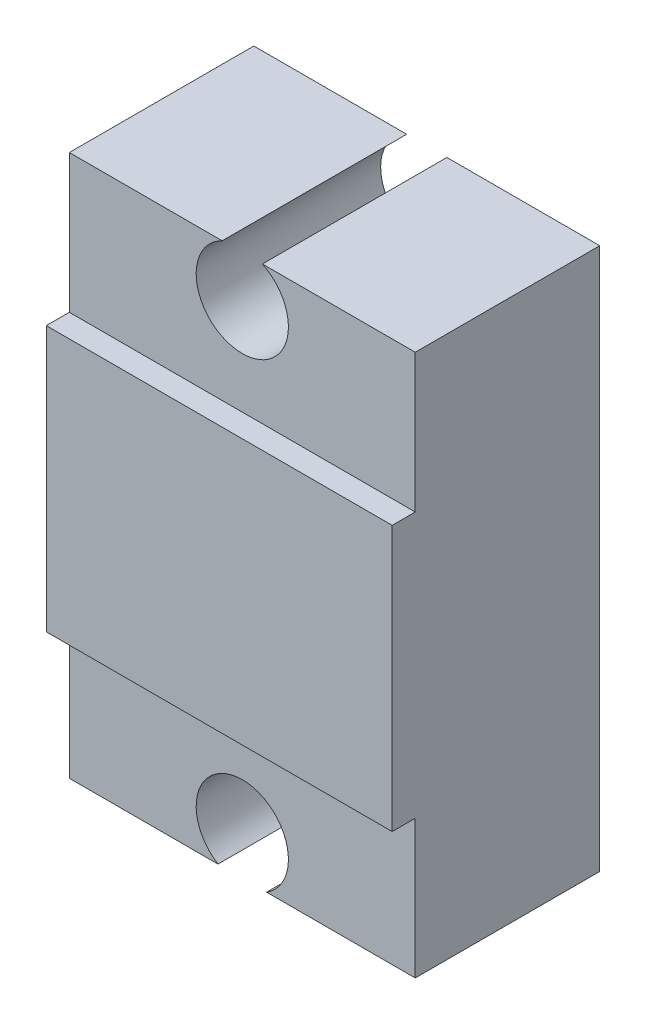
ISO-10303-21;
HEADER;
FILE_DESCRIPTION(('STEP AP214'),'2;1');
FILE_NAME('part.step','',(''),(''),'','','');
FILE_SCHEMA(('AUTOMOTIVE_DESIGN { 1 0 10303 214 1 1 1 1 }'));
ENDSEC;
DATA;
#1=APPLICATION_CONTEXT('core data for automotive mechanical design processes');
#2=APPLICATION_PROTOCOL_DEFINITION('international standard','automotive_design',2000,#1);
#3=PRODUCT_CONTEXT('',#1,'mechanical');
#4=PRODUCT('Part','Part','',(#3));
#5=PRODUCT_RELATED_PRODUCT_CATEGORY('part','',(#4));
#6=PRODUCT_DEFINITION_FORMATION('','',#4);
#7=PRODUCT_DEFINITION_CONTEXT('part definition',#1,'design');
#8=PRODUCT_DEFINITION('design','',#6,#7);
#9=PRODUCT_DEFINITION_SHAPE('','',#8);
#10=(LENGTH_UNIT() NAMED_UNIT(*) SI_UNIT(.MILLI.,.METRE.));
#11=(NAMED_UNIT(*) PLANE_ANGLE_UNIT() SI_UNIT($,.RADIAN.));
#12=(NAMED_UNIT(*) SI_UNIT($,.STERADIAN.) SOLID_ANGLE_UNIT());
#13=UNCERTAINTY_MEASURE_WITH_UNIT(LENGTH_MEASURE(1.E-05),#10,'distance_accuracy_value','');
#14=(GEOMETRIC_REPRESENTATION_CONTEXT(3) GLOBAL_UNCERTAINTY_ASSIGNED_CONTEXT((#13)) GLOBAL_UNIT_ASSIGNED_CONTEXT((#10,
#11,#12)) REPRESENTATION_CONTEXT('',''));
#15=CARTESIAN_POINT('',(0.,0.,0.));
#16=DIRECTION('',(0.,0.,1.));
#17=DIRECTION('',(1.,0.,0.));
#18=AXIS2_PLACEMENT_3D('',#15,#16,#17);
#19=CARTESIAN_POINT('',(-7.86190476190475,-19.828630952381,11.43));
#20=DIRECTION('',(0.,1.,0.));
#21=DIRECTION('',(0.,0.,1.));
#22=AXIS2_PLACEMENT_3D('',#19,#20,#21);
#23=PLANE('',#22);
#24=DIRECTION('',(0.,0.,1.));
#25=VECTOR('',#24,1.);
#26=CARTESIAN_POINT('',(0.32506721148295,-19.828630952381,0.));
#27=LINE('',#26,#25);
#28=CARTESIAN_POINT('',(0.32506721148295,-19.828630952381,0.));
#29=VERTEX_POINT('',#28);
#30=CARTESIAN_POINT('',(0.32506721148295,-19.828630952381,10.16));
#31=VERTEX_POINT('',#30);
#32=EDGE_CURVE('E186',#29,#31,#27,.T.);
#33=ORIENTED_EDGE('',*,*,#32,.T.);
#34=DIRECTION('',(1.,0.,0.));
#35=VECTOR('',#34,1.);
#36=CARTESIAN_POINT('',(-7.86190476190475,-19.828630952381,10.16));
#37=LINE('',#36,#35);
#38=CARTESIAN_POINT('',(-7.86190476190475,-19.828630952381,10.16));
#39=VERTEX_POINT('',#38);
#40=EDGE_CURVE('E55',#39,#31,#37,.T.);
#41=ORIENTED_EDGE('',*,*,#40,.F.);
#42=DIRECTION('',(0.,0.,-1.));
#43=VECTOR('',#42,1.);
#44=CARTESIAN_POINT('',(-7.86190476190475,-19.828630952381,11.43));
#45=LINE('',#44,#43);
#46=CARTESIAN_POINT('',(-7.86190476190475,-19.828630952381,0.));
#47=VERTEX_POINT('',#46);
#48=EDGE_CURVE('E230',#39,#47,#45,.T.);
#49=ORIENTED_EDGE('',*,*,#48,.T.);
#50=DIRECTION('',(1.,0.,0.));
#51=VECTOR('',#50,1.);
#52=CARTESIAN_POINT('',(-7.86190476190475,-19.828630952381,0.));
#53=LINE('',#52,#51);
#54=EDGE_CURVE('E210',#47,#29,#53,.T.);
#55=ORIENTED_EDGE('',*,*,#54,.T.);
#56=EDGE_LOOP('',(#33,#41,#49,#55));
#57=FACE_BOUND('',#56,.T.);
#58=ADVANCED_FACE('F39',(#57),#23,.F.);
#59=CARTESIAN_POINT('',(-7.86190476190475,10.016369047619,11.43));
#60=DIRECTION('',(0.,-1.,0.));
#61=DIRECTION('',(0.,0.,-1.));
#62=AXIS2_PLACEMENT_3D('',#59,#60,#61);
#63=PLANE('',#62);
#64=DIRECTION('',(0.,0.,1.));
#65=VECTOR('',#64,1.);
#66=CARTESIAN_POINT('',(2.77025556975458,10.016369047619,0.));
#67=LINE('',#66,#65);
#68=CARTESIAN_POINT('',(2.77025556975458,10.016369047619,0.));
#69=VERTEX_POINT('',#68);
#70=CARTESIAN_POINT('',(2.77025556975458,10.016369047619,10.16));
#71=VERTEX_POINT('',#70);
#72=EDGE_CURVE('E193',#69,#71,#67,.T.);
#73=ORIENTED_EDGE('',*,*,#72,.T.);
#74=DIRECTION('',(-1.,0.,0.));
#75=VECTOR('',#74,1.);
#76=CARTESIAN_POINT('',(-7.86190476190475,10.016369047619,10.16));
#77=LINE('',#76,#75);
#78=CARTESIAN_POINT('',(11.1880952380953,10.016369047619,10.16));
#79=VERTEX_POINT('',#78);
#80=EDGE_CURVE('E62',#79,#71,#77,.T.);
#81=ORIENTED_EDGE('',*,*,#80,.F.);
#82=DIRECTION('',(0.,0.,-1.));
#83=VECTOR('',#82,1.);
#84=CARTESIAN_POINT('',(11.1880952380952,10.016369047619,11.43));
#85=LINE('',#84,#83);
#86=CARTESIAN_POINT('',(11.1880952380952,10.016369047619,0.));
#87=VERTEX_POINT('',#86);
#88=EDGE_CURVE('E224',#79,#87,#85,.T.);
#89=ORIENTED_EDGE('',*,*,#88,.T.);
#90=DIRECTION('',(-1.,0.,0.));
#91=VECTOR('',#90,1.);
#92=CARTESIAN_POINT('',(-7.86190476190475,10.016369047619,0.));
#93=LINE('',#92,#91);
#94=EDGE_CURVE('E201',#87,#69,#93,.T.);
#95=ORIENTED_EDGE('',*,*,#94,.T.);
#96=EDGE_LOOP('',(#73,#81,#89,#95));
#97=FACE_BOUND('',#96,.T.);
#98=ADVANCED_FACE('F246',(#97),#63,.F.);
#99=CARTESIAN_POINT('',(-7.86190476190475,10.016369047619,11.43));
#100=DIRECTION('',(1.,0.,0.));
#101=DIRECTION('',(0.,1.,0.));
#102=AXIS2_PLACEMENT_3D('',#99,#100,#101);
#103=PLANE('',#102);
#104=DIRECTION('',(0.,-1.,0.));
#105=VECTOR('',#104,1.);
#106=CARTESIAN_POINT('',(-7.86190476190475,10.016369047619,11.43));
#107=LINE('',#106,#105);
#108=CARTESIAN_POINT('',(-7.86190476190475,2.39636904761905,11.43));
#109=VERTEX_POINT('',#108);
#110=CARTESIAN_POINT('',(-7.86190476190475,-12.208630952381,11.43));
#111=VERTEX_POINT('',#110);
#112=EDGE_CURVE('E152',#109,#111,#107,.T.);
#113=ORIENTED_EDGE('',*,*,#112,.F.);
#114=DIRECTION('',(0.,0.,1.));
#115=VECTOR('',#114,1.);
#116=CARTESIAN_POINT('',(-7.86190476190475,2.39636904761905,10.16));
#117=LINE('',#116,#115);
#118=CARTESIAN_POINT('',(-7.86190476190475,2.39636904761905,10.16));
#119=VERTEX_POINT('',#118);
#120=EDGE_CURVE('E131',#119,#109,#117,.T.);
#121=ORIENTED_EDGE('',*,*,#120,.F.);
#122=DIRECTION('',(0.,-1.,0.));
#123=VECTOR('',#122,1.);
#124=CARTESIAN_POINT('',(-7.86190476190475,2.39636904761905,10.16));
#125=LINE('',#124,#123);
#126=CARTESIAN_POINT('',(-7.86190476190475,10.016369047619,10.16));
#127=VERTEX_POINT('',#126);
#128=EDGE_CURVE('E138',#127,#119,#125,.T.);
#129=ORIENTED_EDGE('',*,*,#128,.F.);
#130=DIRECTION('',(0.,0.,-1.));
#131=VECTOR('',#130,1.);
#132=CARTESIAN_POINT('',(-7.86190476190475,10.016369047619,11.43));
#133=LINE('',#132,#131);
#134=CARTESIAN_POINT('',(-7.86190476190475,10.016369047619,0.));
#135=VERTEX_POINT('',#134);
#136=EDGE_CURVE('E205',#127,#135,#133,.T.);
#137=ORIENTED_EDGE('',*,*,#136,.T.);
#138=DIRECTION('',(0.,-1.,0.));
#139=VECTOR('',#138,1.);
#140=CARTESIAN_POINT('',(-7.86190476190475,10.016369047619,0.));
#141=LINE('',#140,#139);
#142=EDGE_CURVE('E197',#135,#47,#141,.T.);
#143=ORIENTED_EDGE('',*,*,#142,.T.);
#144=ORIENTED_EDGE('',*,*,#48,.F.);
#145=DIRECTION('',(0.,-1.,0.));
#146=VECTOR('',#145,1.);
#147=CARTESIAN_POINT('',(-7.86190476190475,-19.828630952381,10.16));
#148=LINE('',#147,#146);
#149=CARTESIAN_POINT('',(-7.86190476190475,-12.208630952381,10.16));
#150=VERTEX_POINT('',#149);
#151=EDGE_CURVE('E162',#150,#39,#148,.T.);
#152=ORIENTED_EDGE('',*,*,#151,.F.);
#153=DIRECTION('',(0.,0.,1.));
#154=VECTOR('',#153,1.);
#155=CARTESIAN_POINT('',(-7.86190476190475,-12.208630952381,10.16));
#156=LINE('',#155,#154);
#157=EDGE_CURVE('E179',#150,#111,#156,.T.);
#158=ORIENTED_EDGE('',*,*,#157,.T.);
#159=EDGE_LOOP('',(#113,#121,#129,#137,#143,#144,#152,#158));
#160=FACE_BOUND('',#159,.T.);
#161=ADVANCED_FACE('F41',(#160),#103,.F.);
#162=DIRECTION('',(0.,0.,-1.));
#163=VECTOR('',#162,1.);
#164=CARTESIAN_POINT('',(11.1880952380953,-19.828630952381,11.43));
#165=LINE('',#164,#163);
#166=CARTESIAN_POINT('',(11.1880952380953,-19.828630952381,10.16));
#167=VERTEX_POINT('',#166);
#168=CARTESIAN_POINT('',(11.1880952380953,-19.828630952381,0.));
#169=VERTEX_POINT('',#168);
#170=EDGE_CURVE('E227',#167,#169,#165,.T.);
#171=ORIENTED_EDGE('',*,*,#170,.F.);
#172=CARTESIAN_POINT('',(3.00112326470755,-19.828630952381,10.16));
#173=VERTEX_POINT('',#172);
#174=EDGE_CURVE('E165',#173,#167,#37,.T.);
#175=ORIENTED_EDGE('',*,*,#174,.F.);
#176=DIRECTION('',(0.,0.,1.));
#177=VECTOR('',#176,1.);
#178=CARTESIAN_POINT('',(3.00112326470755,-19.828630952381,0.));
#179=LINE('',#178,#177);
#180=CARTESIAN_POINT('',(3.00112326470755,-19.828630952381,0.));
#181=VERTEX_POINT('',#180);
#182=EDGE_CURVE('E157',#173,#181,#179,.F.);
#183=ORIENTED_EDGE('',*,*,#182,.T.);
#184=EDGE_CURVE('E209',#181,#169,#53,.T.);
#185=ORIENTED_EDGE('',*,*,#184,.T.);
#186=EDGE_LOOP('',(#171,#175,#183,#185));
#187=FACE_BOUND('',#186,.T.);
#188=ADVANCED_FACE('F263',(#187),#23,.F.);
#189=CARTESIAN_POINT('',(11.1880952380952,10.016369047619,11.43));
#190=DIRECTION('',(-1.,0.,0.));
#191=DIRECTION('',(0.,-1.,0.));
#192=AXIS2_PLACEMENT_3D('',#189,#190,#191);
#193=PLANE('',#192);
#194=DIRECTION('',(0.,1.,0.));
#195=VECTOR('',#194,1.);
#196=CARTESIAN_POINT('',(11.1880952380953,2.39636904761905,10.16));
#197=LINE('',#196,#195);
#198=CARTESIAN_POINT('',(11.1880952380953,2.39636904761905,10.16));
#199=VERTEX_POINT('',#198);
#200=EDGE_CURVE('E137',#199,#79,#197,.T.);
#201=ORIENTED_EDGE('',*,*,#200,.F.);
#202=DIRECTION('',(0.,0.,1.));
#203=VECTOR('',#202,1.);
#204=CARTESIAN_POINT('',(11.1880952380953,2.39636904761905,10.16));
#205=LINE('',#204,#203);
#206=CARTESIAN_POINT('',(11.1880952380953,2.39636904761905,11.43));
#207=VERTEX_POINT('',#206);
#208=EDGE_CURVE('E134',#199,#207,#205,.T.);
#209=ORIENTED_EDGE('',*,*,#208,.T.);
#210=DIRECTION('',(0.,1.,0.));
#211=VECTOR('',#210,1.);
#212=CARTESIAN_POINT('',(11.1880952380952,10.016369047619,11.43));
#213=LINE('',#212,#211);
#214=CARTESIAN_POINT('',(11.1880952380953,-12.208630952381,11.43));
#215=VERTEX_POINT('',#214);
#216=EDGE_CURVE('E200',#215,#207,#213,.T.);
#217=ORIENTED_EDGE('',*,*,#216,.F.);
#218=DIRECTION('',(0.,0.,1.));
#219=VECTOR('',#218,1.);
#220=CARTESIAN_POINT('',(11.1880952380953,-12.208630952381,10.16));
#221=LINE('',#220,#219);
#222=CARTESIAN_POINT('',(11.1880952380953,-12.208630952381,10.16));
#223=VERTEX_POINT('',#222);
#224=EDGE_CURVE('E176',#223,#215,#221,.T.);
#225=ORIENTED_EDGE('',*,*,#224,.F.);
#226=DIRECTION('',(0.,1.,0.));
#227=VECTOR('',#226,1.);
#228=CARTESIAN_POINT('',(11.1880952380953,-19.828630952381,10.16));
#229=LINE('',#228,#227);
#230=EDGE_CURVE('E169',#167,#223,#229,.T.);
#231=ORIENTED_EDGE('',*,*,#230,.F.);
#232=ORIENTED_EDGE('',*,*,#170,.T.);
#233=DIRECTION('',(0.,1.,0.));
#234=VECTOR('',#233,1.);
#235=CARTESIAN_POINT('',(11.1880952380952,10.016369047619,0.));
#236=LINE('',#235,#234);
#237=EDGE_CURVE('E214',#169,#87,#236,.T.);
#238=ORIENTED_EDGE('',*,*,#237,.T.);
#239=ORIENTED_EDGE('',*,*,#88,.F.);
#240=EDGE_LOOP('',(#201,#209,#217,#225,#231,#232,#238,#239));
#241=FACE_BOUND('',#240,.T.);
#242=ADVANCED_FACE('F279',(#241),#193,.F.);
#243=ORIENTED_EDGE('',*,*,#136,.F.);
#244=CARTESIAN_POINT('',(0.555934906435915,10.016369047619,10.16));
#245=VERTEX_POINT('',#244);
#246=EDGE_CURVE('E143',#245,#127,#77,.T.);
#247=ORIENTED_EDGE('',*,*,#246,.F.);
#248=DIRECTION('',(0.,0.,1.));
#249=VECTOR('',#248,1.);
#250=CARTESIAN_POINT('',(0.555934906435915,10.016369047619,0.));
#251=LINE('',#250,#249);
#252=CARTESIAN_POINT('',(0.555934906435915,10.016369047619,0.));
#253=VERTEX_POINT('',#252);
#254=EDGE_CURVE('E190',#245,#253,#251,.F.);
#255=ORIENTED_EDGE('',*,*,#254,.T.);
#256=EDGE_CURVE('E218',#253,#135,#93,.T.);
#257=ORIENTED_EDGE('',*,*,#256,.T.);
#258=EDGE_LOOP('',(#243,#247,#255,#257));
#259=FACE_BOUND('',#258,.T.);
#260=ADVANCED_FACE('F271',(#259),#63,.F.);
#261=CARTESIAN_POINT('',(0.,0.,11.43));
#262=DIRECTION('',(0.,0.,1.));
#263=DIRECTION('',(1.,0.,0.));
#264=AXIS2_PLACEMENT_3D('',#261,#262,#263);
#265=PLANE('',#264);
#266=DIRECTION('',(1.,0.,0.));
#267=VECTOR('',#266,1.);
#268=CARTESIAN_POINT('',(-7.86190476190475,2.39636904761905,11.43));
#269=LINE('',#268,#267);
#270=EDGE_CURVE('E147',#109,#207,#269,.T.);
#271=ORIENTED_EDGE('',*,*,#270,.F.);
#272=ORIENTED_EDGE('',*,*,#112,.T.);
#273=DIRECTION('',(-1.,0.,0.));
#274=VECTOR('',#273,1.);
#275=CARTESIAN_POINT('',(-7.86190476190475,-12.208630952381,11.43));
#276=LINE('',#275,#274);
#277=EDGE_CURVE('E166',#215,#111,#276,.T.);
#278=ORIENTED_EDGE('',*,*,#277,.F.);
#279=ORIENTED_EDGE('',*,*,#216,.T.);
#280=EDGE_LOOP('',(#271,#272,#278,#279));
#281=FACE_BOUND('',#280,.T.);
#282=ADVANCED_FACE('F282',(#281),#265,.T.);
#283=CARTESIAN_POINT('',(0.,0.,0.));
#284=DIRECTION('',(0.,0.,1.));
#285=DIRECTION('',(1.,0.,0.));
#286=AXIS2_PLACEMENT_3D('',#283,#284,#285);
#287=PLANE('',#286);
#288=ORIENTED_EDGE('',*,*,#256,.F.);
#289=CARTESIAN_POINT('',(1.66309523809525,7.73036904761905,0.));
#290=DIRECTION('',(0.,0.,1.));
#291=DIRECTION('',(1.,0.,0.));
#292=AXIS2_PLACEMENT_3D('',#289,#290,#291);
#293=CIRCLE('',#292,2.54);
#294=EDGE_CURVE('E237',#253,#69,#293,.T.);
#295=ORIENTED_EDGE('',*,*,#294,.T.);
#296=ORIENTED_EDGE('',*,*,#94,.F.);
#297=ORIENTED_EDGE('',*,*,#237,.F.);
#298=ORIENTED_EDGE('',*,*,#184,.F.);
#299=CARTESIAN_POINT('',(1.66309523809525,-17.669630952381,0.));
#300=DIRECTION('',(0.,0.,1.));
#301=DIRECTION('',(1.,0.,0.));
#302=AXIS2_PLACEMENT_3D('',#299,#300,#301);
#303=CIRCLE('',#302,2.54);
#304=EDGE_CURVE('E233',#181,#29,#303,.T.);
#305=ORIENTED_EDGE('',*,*,#304,.T.);
#306=ORIENTED_EDGE('',*,*,#54,.F.);
#307=ORIENTED_EDGE('',*,*,#142,.F.);
#308=EDGE_LOOP('',(#288,#295,#296,#297,#298,#305,#306,#307));
#309=FACE_BOUND('',#308,.T.);
#310=ADVANCED_FACE('F252',(#309),#287,.F.);
#311=CARTESIAN_POINT('',(1.66309523809525,-17.669630952381,0.));
#312=DIRECTION('',(0.,0.,1.));
#313=DIRECTION('',(1.,0.,0.));
#314=AXIS2_PLACEMENT_3D('',#311,#312,#313);
#315=CYLINDRICAL_SURFACE('',#314,2.54);
#316=ORIENTED_EDGE('',*,*,#182,.F.);
#317=CARTESIAN_POINT('',(1.66309523809525,-17.669630952381,10.16));
#318=DIRECTION('',(0.,0.,-1.));
#319=DIRECTION('',(-1.,0.,0.));
#320=AXIS2_PLACEMENT_3D('',#317,#318,#319);
#321=CIRCLE('',#320,2.54);
#322=EDGE_CURVE('E11',#173,#31,#321,.F.);
#323=ORIENTED_EDGE('',*,*,#322,.T.);
#324=ORIENTED_EDGE('',*,*,#32,.F.);
#325=ORIENTED_EDGE('',*,*,#304,.F.);
#326=EDGE_LOOP('',(#316,#323,#324,#325));
#327=FACE_BOUND('',#326,.T.);
#328=ADVANCED_FACE('F289',(#327),#315,.F.);
#329=CARTESIAN_POINT('',(1.66309523809525,7.73036904761905,0.));
#330=DIRECTION('',(0.,0.,1.));
#331=DIRECTION('',(1.,0.,0.));
#332=AXIS2_PLACEMENT_3D('',#329,#330,#331);
#333=CYLINDRICAL_SURFACE('',#332,2.54);
#334=ORIENTED_EDGE('',*,*,#254,.F.);
#335=CARTESIAN_POINT('',(1.66309523809525,7.73036904761905,10.16));
#336=DIRECTION('',(0.,0.,-1.));
#337=DIRECTION('',(-1.,0.,0.));
#338=AXIS2_PLACEMENT_3D('',#335,#336,#337);
#339=CIRCLE('',#338,2.54);
#340=EDGE_CURVE('E48',#245,#71,#339,.F.);
#341=ORIENTED_EDGE('',*,*,#340,.T.);
#342=ORIENTED_EDGE('',*,*,#72,.F.);
#343=ORIENTED_EDGE('',*,*,#294,.F.);
#344=EDGE_LOOP('',(#334,#341,#342,#343));
#345=FACE_BOUND('',#344,.T.);
#346=ADVANCED_FACE('F243',(#345),#333,.F.);
#347=CARTESIAN_POINT('',(0.,0.,10.16));
#348=DIRECTION('',(0.,0.,-1.));
#349=DIRECTION('',(-1.,0.,0.));
#350=AXIS2_PLACEMENT_3D('',#347,#348,#349);
#351=PLANE('',#350);
#352=ORIENTED_EDGE('',*,*,#246,.T.);
#353=ORIENTED_EDGE('',*,*,#128,.T.);
#354=DIRECTION('',(1.,0.,0.));
#355=VECTOR('',#354,1.);
#356=CARTESIAN_POINT('',(-7.86190476190475,2.39636904761905,10.16));
#357=LINE('',#356,#355);
#358=EDGE_CURVE('E127',#119,#199,#357,.T.);
#359=ORIENTED_EDGE('',*,*,#358,.T.);
#360=ORIENTED_EDGE('',*,*,#200,.T.);
#361=ORIENTED_EDGE('',*,*,#80,.T.);
#362=ORIENTED_EDGE('',*,*,#340,.F.);
#363=EDGE_LOOP('',(#352,#353,#359,#360,#361,#362));
#364=FACE_BOUND('',#363,.T.);
#365=ADVANCED_FACE('F141',(#364),#351,.F.);
#366=CARTESIAN_POINT('',(-7.86190476190475,2.39636904761905,10.16));
#367=DIRECTION('',(0.,-1.,0.));
#368=DIRECTION('',(0.,0.,-1.));
#369=AXIS2_PLACEMENT_3D('',#366,#367,#368);
#370=PLANE('',#369);
#371=ORIENTED_EDGE('',*,*,#270,.T.);
#372=ORIENTED_EDGE('',*,*,#208,.F.);
#373=ORIENTED_EDGE('',*,*,#358,.F.);
#374=ORIENTED_EDGE('',*,*,#120,.T.);
#375=EDGE_LOOP('',(#371,#372,#373,#374));
#376=FACE_BOUND('',#375,.T.);
#377=ADVANCED_FACE('F129',(#376),#370,.F.);
#378=CARTESIAN_POINT('',(0.,0.,10.16));
#379=DIRECTION('',(0.,0.,-1.));
#380=DIRECTION('',(-1.,0.,0.));
#381=AXIS2_PLACEMENT_3D('',#378,#379,#380);
#382=PLANE('',#381);
#383=ORIENTED_EDGE('',*,*,#174,.T.);
#384=ORIENTED_EDGE('',*,*,#230,.T.);
#385=DIRECTION('',(-1.,0.,0.));
#386=VECTOR('',#385,1.);
#387=CARTESIAN_POINT('',(-7.86190476190475,-12.208630952381,10.16));
#388=LINE('',#387,#386);
#389=EDGE_CURVE('E172',#223,#150,#388,.T.);
#390=ORIENTED_EDGE('',*,*,#389,.T.);
#391=ORIENTED_EDGE('',*,*,#151,.T.);
#392=ORIENTED_EDGE('',*,*,#40,.T.);
#393=ORIENTED_EDGE('',*,*,#322,.F.);
#394=EDGE_LOOP('',(#383,#384,#390,#391,#392,#393));
#395=FACE_BOUND('',#394,.T.);
#396=ADVANCED_FACE('F287',(#395),#382,.F.);
#397=CARTESIAN_POINT('',(-7.86190476190475,-12.208630952381,10.16));
#398=DIRECTION('',(0.,1.,0.));
#399=DIRECTION('',(0.,0.,1.));
#400=AXIS2_PLACEMENT_3D('',#397,#398,#399);
#401=PLANE('',#400);
#402=ORIENTED_EDGE('',*,*,#277,.T.);
#403=ORIENTED_EDGE('',*,*,#157,.F.);
#404=ORIENTED_EDGE('',*,*,#389,.F.);
#405=ORIENTED_EDGE('',*,*,#224,.T.);
#406=EDGE_LOOP('',(#402,#403,#404,#405));
#407=FACE_BOUND('',#406,.T.);
#408=ADVANCED_FACE('F284',(#407),#401,.F.);
#409=CLOSED_SHELL('',(#58,#98,#161,#188,#242,#260,#282,#310,#328,#346,#365,#377,#396,#408));
#410=MANIFOLD_SOLID_BREP('B2',#409);
#411=ADVANCED_BREP_SHAPE_REPRESENTATION('',(#18,#410),#14);
#412=SHAPE_DEFINITION_REPRESENTATION(#9,#411);
ENDSEC;
END-ISO-10303-21;
